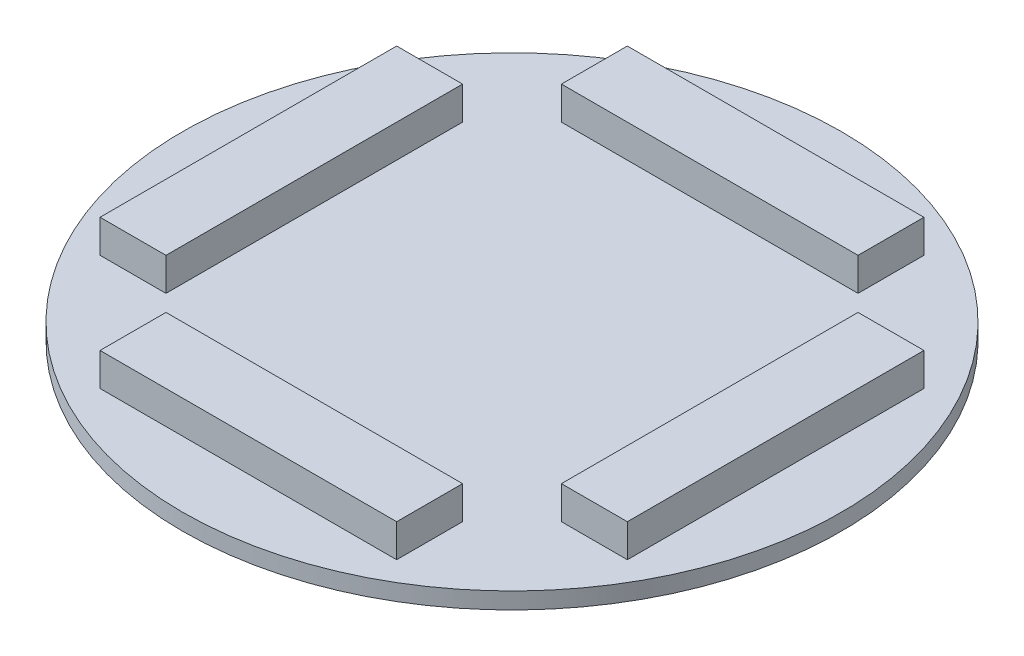
ISO-10303-21;
HEADER;
FILE_DESCRIPTION(('STEP AP214'),'2;1');
FILE_NAME('part.step','',(''),(''),'','','');
FILE_SCHEMA(('AUTOMOTIVE_DESIGN { 1 0 10303 214 1 1 1 1 }'));
ENDSEC;
DATA;
#1=APPLICATION_CONTEXT('core data for automotive mechanical design processes');
#2=APPLICATION_PROTOCOL_DEFINITION('international standard','automotive_design',2000,#1);
#3=PRODUCT_CONTEXT('',#1,'mechanical');
#4=PRODUCT('Part','Part','',(#3));
#5=PRODUCT_RELATED_PRODUCT_CATEGORY('part','',(#4));
#6=PRODUCT_DEFINITION_FORMATION('','',#4);
#7=PRODUCT_DEFINITION_CONTEXT('part definition',#1,'design');
#8=PRODUCT_DEFINITION('design','',#6,#7);
#9=PRODUCT_DEFINITION_SHAPE('','',#8);
#10=(LENGTH_UNIT() NAMED_UNIT(*) SI_UNIT(.MILLI.,.METRE.));
#11=(NAMED_UNIT(*) PLANE_ANGLE_UNIT() SI_UNIT($,.RADIAN.));
#12=(NAMED_UNIT(*) SI_UNIT($,.STERADIAN.) SOLID_ANGLE_UNIT());
#13=UNCERTAINTY_MEASURE_WITH_UNIT(LENGTH_MEASURE(1.E-05),#10,'distance_accuracy_value','');
#14=(GEOMETRIC_REPRESENTATION_CONTEXT(3) GLOBAL_UNCERTAINTY_ASSIGNED_CONTEXT((#13)) GLOBAL_UNIT_ASSIGNED_CONTEXT((#10,
#11,#12)) REPRESENTATION_CONTEXT('',''));
#15=CARTESIAN_POINT('',(0.,0.,0.));
#16=DIRECTION('',(0.,0.,1.));
#17=DIRECTION('',(1.,0.,0.));
#18=AXIS2_PLACEMENT_3D('',#15,#16,#17);
#19=CARTESIAN_POINT('',(0.,1.,0.));
#20=DIRECTION('',(0.,1.,0.));
#21=DIRECTION('',(0.,0.,1.));
#22=AXIS2_PLACEMENT_3D('',#19,#20,#21);
#23=PLANE('',#22);
#24=CARTESIAN_POINT('',(0.,1.,0.));
#25=DIRECTION('',(0.,1.,0.));
#26=DIRECTION('',(0.,0.,1.));
#27=AXIS2_PLACEMENT_3D('',#24,#25,#26);
#28=CIRCLE('',#27,20.);
#29=CARTESIAN_POINT('',(0.,1.,20.));
#30=VERTEX_POINT('',#29);
#31=EDGE_CURVE('E11',#30,#30,#28,.T.);
#32=ORIENTED_EDGE('',*,*,#31,.T.);
#33=EDGE_LOOP('',(#32));
#34=FACE_BOUND('',#33,.T.);
#35=DIRECTION('',(1.,0.,0.));
#36=VECTOR('',#35,1.);
#37=CARTESIAN_POINT('',(-9.,1.,-12.));
#38=LINE('',#37,#36);
#39=CARTESIAN_POINT('',(-9.,1.,-12.));
#40=VERTEX_POINT('',#39);
#41=CARTESIAN_POINT('',(9.,1.,-12.));
#42=VERTEX_POINT('',#41);
#43=EDGE_CURVE('E259',#40,#42,#38,.T.);
#44=ORIENTED_EDGE('',*,*,#43,.F.);
#45=DIRECTION('',(0.,0.,1.));
#46=VECTOR('',#45,1.);
#47=CARTESIAN_POINT('',(-9.,1.,-16.));
#48=LINE('',#47,#46);
#49=CARTESIAN_POINT('',(-9.,1.,-16.));
#50=VERTEX_POINT('',#49);
#51=EDGE_CURVE('E243',#50,#40,#48,.T.);
#52=ORIENTED_EDGE('',*,*,#51,.F.);
#53=DIRECTION('',(1.,0.,0.));
#54=VECTOR('',#53,1.);
#55=CARTESIAN_POINT('',(-9.,1.,-16.));
#56=LINE('',#55,#54);
#57=CARTESIAN_POINT('',(9.,1.,-16.));
#58=VERTEX_POINT('',#57);
#59=EDGE_CURVE('E248',#50,#58,#56,.T.);
#60=ORIENTED_EDGE('',*,*,#59,.T.);
#61=DIRECTION('',(0.,0.,1.));
#62=VECTOR('',#61,1.);
#63=CARTESIAN_POINT('',(9.,1.,-16.));
#64=LINE('',#63,#62);
#65=EDGE_CURVE('E262',#58,#42,#64,.T.);
#66=ORIENTED_EDGE('',*,*,#65,.T.);
#67=EDGE_LOOP('',(#44,#52,#60,#66));
#68=FACE_BOUND('',#67,.T.);
#69=DIRECTION('',(0.,0.,-1.));
#70=VECTOR('',#69,1.);
#71=CARTESIAN_POINT('',(-12.,1.,9.00000000000004));
#72=LINE('',#71,#70);
#73=CARTESIAN_POINT('',(-12.,1.,9.00000000000004));
#74=VERTEX_POINT('',#73);
#75=CARTESIAN_POINT('',(-12.,1.,-8.99999999999996));
#76=VERTEX_POINT('',#75);
#77=EDGE_CURVE('E226',#74,#76,#72,.T.);
#78=ORIENTED_EDGE('',*,*,#77,.F.);
#79=DIRECTION('',(1.,0.,0.));
#80=VECTOR('',#79,1.);
#81=CARTESIAN_POINT('',(-16.,1.,9.00000000000006));
#82=LINE('',#81,#80);
#83=CARTESIAN_POINT('',(-16.,1.,9.00000000000006));
#84=VERTEX_POINT('',#83);
#85=EDGE_CURVE('E210',#84,#74,#82,.T.);
#86=ORIENTED_EDGE('',*,*,#85,.F.);
#87=DIRECTION('',(0.,0.,-1.));
#88=VECTOR('',#87,1.);
#89=CARTESIAN_POINT('',(-16.,1.,9.00000000000006));
#90=LINE('',#89,#88);
#91=CARTESIAN_POINT('',(-16.,1.,-8.99999999999994));
#92=VERTEX_POINT('',#91);
#93=EDGE_CURVE('E215',#84,#92,#90,.T.);
#94=ORIENTED_EDGE('',*,*,#93,.T.);
#95=DIRECTION('',(1.,0.,0.));
#96=VECTOR('',#95,1.);
#97=CARTESIAN_POINT('',(-16.,1.,-8.99999999999994));
#98=LINE('',#97,#96);
#99=EDGE_CURVE('E229',#92,#76,#98,.T.);
#100=ORIENTED_EDGE('',*,*,#99,.T.);
#101=EDGE_LOOP('',(#78,#86,#94,#100));
#102=FACE_BOUND('',#101,.T.);
#103=DIRECTION('',(-1.,0.,0.));
#104=VECTOR('',#103,1.);
#105=CARTESIAN_POINT('',(9.,1.,12.));
#106=LINE('',#105,#104);
#107=CARTESIAN_POINT('',(9.,1.,12.));
#108=VERTEX_POINT('',#107);
#109=CARTESIAN_POINT('',(-9.,1.,12.));
#110=VERTEX_POINT('',#109);
#111=EDGE_CURVE('E175',#108,#110,#106,.T.);
#112=ORIENTED_EDGE('',*,*,#111,.F.);
#113=DIRECTION('',(0.,0.,-1.));
#114=VECTOR('',#113,1.);
#115=CARTESIAN_POINT('',(9.,1.,16.));
#116=LINE('',#115,#114);
#117=CARTESIAN_POINT('',(9.,1.,16.));
#118=VERTEX_POINT('',#117);
#119=EDGE_CURVE('E172',#118,#108,#116,.T.);
#120=ORIENTED_EDGE('',*,*,#119,.F.);
#121=DIRECTION('',(-1.,0.,0.));
#122=VECTOR('',#121,1.);
#123=CARTESIAN_POINT('',(9.,1.,16.));
#124=LINE('',#123,#122);
#125=CARTESIAN_POINT('',(-9.,1.,16.));
#126=VERTEX_POINT('',#125);
#127=EDGE_CURVE('E185',#118,#126,#124,.T.);
#128=ORIENTED_EDGE('',*,*,#127,.T.);
#129=DIRECTION('',(0.,0.,-1.));
#130=VECTOR('',#129,1.);
#131=CARTESIAN_POINT('',(-9.,1.,16.));
#132=LINE('',#131,#130);
#133=EDGE_CURVE('E196',#126,#110,#132,.T.);
#134=ORIENTED_EDGE('',*,*,#133,.T.);
#135=EDGE_LOOP('',(#112,#120,#128,#134));
#136=FACE_BOUND('',#135,.T.);
#137=DIRECTION('',(0.,0.,1.));
#138=VECTOR('',#137,1.);
#139=CARTESIAN_POINT('',(11.9999999999999,1.,-9.00000000000012));
#140=LINE('',#139,#138);
#141=CARTESIAN_POINT('',(11.9999999999999,1.,-9.00000000000012));
#142=VERTEX_POINT('',#141);
#143=CARTESIAN_POINT('',(12.0000000000001,1.,8.99999999999988));
#144=VERTEX_POINT('',#143);
#145=EDGE_CURVE('E52',#142,#144,#140,.T.);
#146=ORIENTED_EDGE('',*,*,#145,.F.);
#147=DIRECTION('',(-1.,0.,0.));
#148=VECTOR('',#147,1.);
#149=CARTESIAN_POINT('',(15.9999999999999,1.,-9.00000000000017));
#150=LINE('',#149,#148);
#151=CARTESIAN_POINT('',(15.9999999999999,1.,-9.00000000000017));
#152=VERTEX_POINT('',#151);
#153=EDGE_CURVE('E171',#152,#142,#150,.T.);
#154=ORIENTED_EDGE('',*,*,#153,.F.);
#155=DIRECTION('',(0.,0.,1.));
#156=VECTOR('',#155,1.);
#157=CARTESIAN_POINT('',(15.9999999999999,1.,-9.00000000000017));
#158=LINE('',#157,#156);
#159=CARTESIAN_POINT('',(16.0000000000001,1.,8.99999999999983));
#160=VERTEX_POINT('',#159);
#161=EDGE_CURVE('E168',#152,#160,#158,.T.);
#162=ORIENTED_EDGE('',*,*,#161,.T.);
#163=DIRECTION('',(-1.,0.,0.));
#164=VECTOR('',#163,1.);
#165=CARTESIAN_POINT('',(16.0000000000001,1.,8.99999999999983));
#166=LINE('',#165,#164);
#167=EDGE_CURVE('E57',#160,#144,#166,.T.);
#168=ORIENTED_EDGE('',*,*,#167,.T.);
#169=EDGE_LOOP('',(#146,#154,#162,#168));
#170=FACE_BOUND('',#169,.T.);
#171=ADVANCED_FACE('F37',(#34,#68,#102,#136,#170),#23,.T.);
#172=CARTESIAN_POINT('',(0.,1.,0.));
#173=DIRECTION('',(0.,-1.,0.));
#174=DIRECTION('',(0.,0.,-1.));
#175=AXIS2_PLACEMENT_3D('',#172,#173,#174);
#176=CYLINDRICAL_SURFACE('',#175,20.);
#177=ORIENTED_EDGE('',*,*,#31,.F.);
#178=EDGE_LOOP('',(#177));
#179=FACE_BOUND('',#178,.T.);
#180=CARTESIAN_POINT('',(0.,0.,0.));
#181=DIRECTION('',(0.,1.,0.));
#182=DIRECTION('',(0.,0.,1.));
#183=AXIS2_PLACEMENT_3D('',#180,#181,#182);
#184=CIRCLE('',#183,20.);
#185=CARTESIAN_POINT('',(0.,0.,20.));
#186=VERTEX_POINT('',#185);
#187=EDGE_CURVE('E41',#186,#186,#184,.T.);
#188=ORIENTED_EDGE('',*,*,#187,.T.);
#189=EDGE_LOOP('',(#188));
#190=FACE_BOUND('',#189,.T.);
#191=ADVANCED_FACE('F39',(#179,#190),#176,.T.);
#192=CARTESIAN_POINT('',(0.,0.,0.));
#193=DIRECTION('',(0.,1.,0.));
#194=DIRECTION('',(0.,0.,1.));
#195=AXIS2_PLACEMENT_3D('',#192,#193,#194);
#196=PLANE('',#195);
#197=ORIENTED_EDGE('',*,*,#187,.F.);
#198=EDGE_LOOP('',(#197));
#199=FACE_BOUND('',#198,.T.);
#200=ADVANCED_FACE('F281',(#199),#196,.F.);
#201=CARTESIAN_POINT('',(-9.,3.,-16.));
#202=DIRECTION('',(1.,0.,0.));
#203=DIRECTION('',(0.,0.,-1.));
#204=AXIS2_PLACEMENT_3D('',#201,#202,#203);
#205=PLANE('',#204);
#206=ORIENTED_EDGE('',*,*,#51,.T.);
#207=DIRECTION('',(0.,-1.,0.));
#208=VECTOR('',#207,1.);
#209=CARTESIAN_POINT('',(-9.,3.,-12.));
#210=LINE('',#209,#208);
#211=CARTESIAN_POINT('',(-9.,3.,-12.));
#212=VERTEX_POINT('',#211);
#213=EDGE_CURVE('E273',#212,#40,#210,.T.);
#214=ORIENTED_EDGE('',*,*,#213,.F.);
#215=DIRECTION('',(0.,0.,1.));
#216=VECTOR('',#215,1.);
#217=CARTESIAN_POINT('',(-9.,3.,-16.));
#218=LINE('',#217,#216);
#219=CARTESIAN_POINT('',(-9.,3.,-16.));
#220=VERTEX_POINT('',#219);
#221=EDGE_CURVE('E244',#220,#212,#218,.T.);
#222=ORIENTED_EDGE('',*,*,#221,.F.);
#223=DIRECTION('',(0.,-1.,0.));
#224=VECTOR('',#223,1.);
#225=CARTESIAN_POINT('',(-9.,3.,-16.));
#226=LINE('',#225,#224);
#227=EDGE_CURVE('E256',#220,#50,#226,.T.);
#228=ORIENTED_EDGE('',*,*,#227,.T.);
#229=EDGE_LOOP('',(#206,#214,#222,#228));
#230=FACE_BOUND('',#229,.T.);
#231=ADVANCED_FACE('F283',(#230),#205,.F.);
#232=CARTESIAN_POINT('',(-9.,3.,-12.));
#233=DIRECTION('',(0.,0.,-1.));
#234=DIRECTION('',(-1.,0.,0.));
#235=AXIS2_PLACEMENT_3D('',#232,#233,#234);
#236=PLANE('',#235);
#237=ORIENTED_EDGE('',*,*,#43,.T.);
#238=DIRECTION('',(0.,-1.,0.));
#239=VECTOR('',#238,1.);
#240=CARTESIAN_POINT('',(9.,3.,-12.));
#241=LINE('',#240,#239);
#242=CARTESIAN_POINT('',(9.,3.,-12.));
#243=VERTEX_POINT('',#242);
#244=EDGE_CURVE('E270',#243,#42,#241,.T.);
#245=ORIENTED_EDGE('',*,*,#244,.F.);
#246=DIRECTION('',(1.,0.,0.));
#247=VECTOR('',#246,1.);
#248=CARTESIAN_POINT('',(-9.,3.,-12.));
#249=LINE('',#248,#247);
#250=EDGE_CURVE('E247',#212,#243,#249,.T.);
#251=ORIENTED_EDGE('',*,*,#250,.F.);
#252=ORIENTED_EDGE('',*,*,#213,.T.);
#253=EDGE_LOOP('',(#237,#245,#251,#252));
#254=FACE_BOUND('',#253,.T.);
#255=ADVANCED_FACE('F288',(#254),#236,.F.);
#256=CARTESIAN_POINT('',(9.,3.,-16.));
#257=DIRECTION('',(1.,0.,0.));
#258=DIRECTION('',(0.,0.,-1.));
#259=AXIS2_PLACEMENT_3D('',#256,#257,#258);
#260=PLANE('',#259);
#261=ORIENTED_EDGE('',*,*,#65,.F.);
#262=DIRECTION('',(0.,-1.,0.));
#263=VECTOR('',#262,1.);
#264=CARTESIAN_POINT('',(9.,3.,-16.));
#265=LINE('',#264,#263);
#266=CARTESIAN_POINT('',(9.,3.,-16.));
#267=VERTEX_POINT('',#266);
#268=EDGE_CURVE('E267',#267,#58,#265,.T.);
#269=ORIENTED_EDGE('',*,*,#268,.F.);
#270=DIRECTION('',(0.,0.,1.));
#271=VECTOR('',#270,1.);
#272=CARTESIAN_POINT('',(9.,3.,-16.));
#273=LINE('',#272,#271);
#274=EDGE_CURVE('E250',#267,#243,#273,.T.);
#275=ORIENTED_EDGE('',*,*,#274,.T.);
#276=ORIENTED_EDGE('',*,*,#244,.T.);
#277=EDGE_LOOP('',(#261,#269,#275,#276));
#278=FACE_BOUND('',#277,.T.);
#279=ADVANCED_FACE('F301',(#278),#260,.T.);
#280=CARTESIAN_POINT('',(-9.,3.,-16.));
#281=DIRECTION('',(0.,0.,-1.));
#282=DIRECTION('',(-1.,0.,0.));
#283=AXIS2_PLACEMENT_3D('',#280,#281,#282);
#284=PLANE('',#283);
#285=ORIENTED_EDGE('',*,*,#59,.F.);
#286=ORIENTED_EDGE('',*,*,#227,.F.);
#287=DIRECTION('',(1.,0.,0.));
#288=VECTOR('',#287,1.);
#289=CARTESIAN_POINT('',(-9.,3.,-16.));
#290=LINE('',#289,#288);
#291=EDGE_CURVE('E253',#220,#267,#290,.T.);
#292=ORIENTED_EDGE('',*,*,#291,.T.);
#293=ORIENTED_EDGE('',*,*,#268,.T.);
#294=EDGE_LOOP('',(#285,#286,#292,#293));
#295=FACE_BOUND('',#294,.T.);
#296=ADVANCED_FACE('F304',(#295),#284,.T.);
#297=CARTESIAN_POINT('',(0.,3.,0.));
#298=DIRECTION('',(0.,1.,0.));
#299=DIRECTION('',(0.,0.,1.));
#300=AXIS2_PLACEMENT_3D('',#297,#298,#299);
#301=PLANE('',#300);
#302=ORIENTED_EDGE('',*,*,#221,.T.);
#303=ORIENTED_EDGE('',*,*,#250,.T.);
#304=ORIENTED_EDGE('',*,*,#274,.F.);
#305=ORIENTED_EDGE('',*,*,#291,.F.);
#306=EDGE_LOOP('',(#302,#303,#304,#305));
#307=FACE_BOUND('',#306,.T.);
#308=ADVANCED_FACE('F308',(#307),#301,.T.);
#309=CARTESIAN_POINT('',(-16.,3.,9.00000000000006));
#310=DIRECTION('',(0.,0.,-1.));
#311=DIRECTION('',(-1.,0.,0.));
#312=AXIS2_PLACEMENT_3D('',#309,#310,#311);
#313=PLANE('',#312);
#314=ORIENTED_EDGE('',*,*,#85,.T.);
#315=DIRECTION('',(0.,-1.,0.));
#316=VECTOR('',#315,1.);
#317=CARTESIAN_POINT('',(-12.,3.,9.00000000000004));
#318=LINE('',#317,#316);
#319=CARTESIAN_POINT('',(-12.,3.,9.00000000000004));
#320=VERTEX_POINT('',#319);
#321=EDGE_CURVE('E240',#320,#74,#318,.T.);
#322=ORIENTED_EDGE('',*,*,#321,.F.);
#323=DIRECTION('',(1.,0.,0.));
#324=VECTOR('',#323,1.);
#325=CARTESIAN_POINT('',(-16.,3.,9.00000000000006));
#326=LINE('',#325,#324);
#327=CARTESIAN_POINT('',(-16.,3.,9.00000000000006));
#328=VERTEX_POINT('',#327);
#329=EDGE_CURVE('E211',#328,#320,#326,.T.);
#330=ORIENTED_EDGE('',*,*,#329,.F.);
#331=DIRECTION('',(0.,-1.,0.));
#332=VECTOR('',#331,1.);
#333=CARTESIAN_POINT('',(-16.,3.,9.00000000000006));
#334=LINE('',#333,#332);
#335=EDGE_CURVE('E223',#328,#84,#334,.T.);
#336=ORIENTED_EDGE('',*,*,#335,.T.);
#337=EDGE_LOOP('',(#314,#322,#330,#336));
#338=FACE_BOUND('',#337,.T.);
#339=ADVANCED_FACE('F312',(#338),#313,.F.);
#340=CARTESIAN_POINT('',(-12.,3.,9.00000000000004));
#341=DIRECTION('',(-1.,0.,0.));
#342=DIRECTION('',(0.,0.,1.));
#343=AXIS2_PLACEMENT_3D('',#340,#341,#342);
#344=PLANE('',#343);
#345=ORIENTED_EDGE('',*,*,#77,.T.);
#346=DIRECTION('',(0.,-1.,0.));
#347=VECTOR('',#346,1.);
#348=CARTESIAN_POINT('',(-12.,3.,-8.99999999999996));
#349=LINE('',#348,#347);
#350=CARTESIAN_POINT('',(-12.,3.,-8.99999999999996));
#351=VERTEX_POINT('',#350);
#352=EDGE_CURVE('E237',#351,#76,#349,.T.);
#353=ORIENTED_EDGE('',*,*,#352,.F.);
#354=DIRECTION('',(0.,0.,-1.));
#355=VECTOR('',#354,1.);
#356=CARTESIAN_POINT('',(-12.,3.,9.00000000000004));
#357=LINE('',#356,#355);
#358=EDGE_CURVE('E214',#320,#351,#357,.T.);
#359=ORIENTED_EDGE('',*,*,#358,.F.);
#360=ORIENTED_EDGE('',*,*,#321,.T.);
#361=EDGE_LOOP('',(#345,#353,#359,#360));
#362=FACE_BOUND('',#361,.T.);
#363=ADVANCED_FACE('F316',(#362),#344,.F.);
#364=CARTESIAN_POINT('',(-16.,3.,-8.99999999999994));
#365=DIRECTION('',(0.,0.,-1.));
#366=DIRECTION('',(-1.,0.,0.));
#367=AXIS2_PLACEMENT_3D('',#364,#365,#366);
#368=PLANE('',#367);
#369=ORIENTED_EDGE('',*,*,#99,.F.);
#370=DIRECTION('',(0.,-1.,0.));
#371=VECTOR('',#370,1.);
#372=CARTESIAN_POINT('',(-16.,3.,-8.99999999999994));
#373=LINE('',#372,#371);
#374=CARTESIAN_POINT('',(-16.,3.,-8.99999999999994));
#375=VERTEX_POINT('',#374);
#376=EDGE_CURVE('E234',#375,#92,#373,.T.);
#377=ORIENTED_EDGE('',*,*,#376,.F.);
#378=DIRECTION('',(1.,0.,0.));
#379=VECTOR('',#378,1.);
#380=CARTESIAN_POINT('',(-16.,3.,-8.99999999999994));
#381=LINE('',#380,#379);
#382=EDGE_CURVE('E217',#375,#351,#381,.T.);
#383=ORIENTED_EDGE('',*,*,#382,.T.);
#384=ORIENTED_EDGE('',*,*,#352,.T.);
#385=EDGE_LOOP('',(#369,#377,#383,#384));
#386=FACE_BOUND('',#385,.T.);
#387=ADVANCED_FACE('F320',(#386),#368,.T.);
#388=CARTESIAN_POINT('',(-16.,3.,9.00000000000006));
#389=DIRECTION('',(-1.,0.,0.));
#390=DIRECTION('',(0.,0.,1.));
#391=AXIS2_PLACEMENT_3D('',#388,#389,#390);
#392=PLANE('',#391);
#393=ORIENTED_EDGE('',*,*,#93,.F.);
#394=ORIENTED_EDGE('',*,*,#335,.F.);
#395=DIRECTION('',(0.,0.,-1.));
#396=VECTOR('',#395,1.);
#397=CARTESIAN_POINT('',(-16.,3.,9.00000000000006));
#398=LINE('',#397,#396);
#399=EDGE_CURVE('E220',#328,#375,#398,.T.);
#400=ORIENTED_EDGE('',*,*,#399,.T.);
#401=ORIENTED_EDGE('',*,*,#376,.T.);
#402=EDGE_LOOP('',(#393,#394,#400,#401));
#403=FACE_BOUND('',#402,.T.);
#404=ADVANCED_FACE('F324',(#403),#392,.T.);
#405=CARTESIAN_POINT('',(0.,3.,0.));
#406=DIRECTION('',(0.,1.,0.));
#407=DIRECTION('',(1.,0.,0.));
#408=AXIS2_PLACEMENT_3D('',#405,#406,#407);
#409=PLANE('',#408);
#410=ORIENTED_EDGE('',*,*,#329,.T.);
#411=ORIENTED_EDGE('',*,*,#358,.T.);
#412=ORIENTED_EDGE('',*,*,#382,.F.);
#413=ORIENTED_EDGE('',*,*,#399,.F.);
#414=EDGE_LOOP('',(#410,#411,#412,#413));
#415=FACE_BOUND('',#414,.T.);
#416=ADVANCED_FACE('F328',(#415),#409,.T.);
#417=CARTESIAN_POINT('',(9.,3.,16.));
#418=DIRECTION('',(-1.,0.,0.));
#419=DIRECTION('',(0.,0.,1.));
#420=AXIS2_PLACEMENT_3D('',#417,#418,#419);
#421=PLANE('',#420);
#422=ORIENTED_EDGE('',*,*,#119,.T.);
#423=DIRECTION('',(0.,-1.,0.));
#424=VECTOR('',#423,1.);
#425=CARTESIAN_POINT('',(9.,3.,12.));
#426=LINE('',#425,#424);
#427=CARTESIAN_POINT('',(9.,3.,12.));
#428=VERTEX_POINT('',#427);
#429=EDGE_CURVE('E207',#428,#108,#426,.T.);
#430=ORIENTED_EDGE('',*,*,#429,.F.);
#431=DIRECTION('',(0.,0.,-1.));
#432=VECTOR('',#431,1.);
#433=CARTESIAN_POINT('',(9.,3.,16.));
#434=LINE('',#433,#432);
#435=CARTESIAN_POINT('',(9.,3.,16.));
#436=VERTEX_POINT('',#435);
#437=EDGE_CURVE('E181',#436,#428,#434,.T.);
#438=ORIENTED_EDGE('',*,*,#437,.F.);
#439=DIRECTION('',(0.,-1.,0.));
#440=VECTOR('',#439,1.);
#441=CARTESIAN_POINT('',(9.,3.,16.));
#442=LINE('',#441,#440);
#443=EDGE_CURVE('E192',#436,#118,#442,.T.);
#444=ORIENTED_EDGE('',*,*,#443,.T.);
#445=EDGE_LOOP('',(#422,#430,#438,#444));
#446=FACE_BOUND('',#445,.T.);
#447=ADVANCED_FACE('F332',(#446),#421,.F.);
#448=CARTESIAN_POINT('',(9.,3.,12.));
#449=DIRECTION('',(0.,0.,1.));
#450=DIRECTION('',(1.,0.,0.));
#451=AXIS2_PLACEMENT_3D('',#448,#449,#450);
#452=PLANE('',#451);
#453=ORIENTED_EDGE('',*,*,#111,.T.);
#454=DIRECTION('',(0.,-1.,0.));
#455=VECTOR('',#454,1.);
#456=CARTESIAN_POINT('',(-9.,3.,12.));
#457=LINE('',#456,#455);
#458=CARTESIAN_POINT('',(-9.,3.,12.));
#459=VERTEX_POINT('',#458);
#460=EDGE_CURVE('E204',#459,#110,#457,.T.);
#461=ORIENTED_EDGE('',*,*,#460,.F.);
#462=DIRECTION('',(-1.,0.,0.));
#463=VECTOR('',#462,1.);
#464=CARTESIAN_POINT('',(9.,3.,12.));
#465=LINE('',#464,#463);
#466=EDGE_CURVE('E184',#428,#459,#465,.T.);
#467=ORIENTED_EDGE('',*,*,#466,.F.);
#468=ORIENTED_EDGE('',*,*,#429,.T.);
#469=EDGE_LOOP('',(#453,#461,#467,#468));
#470=FACE_BOUND('',#469,.T.);
#471=ADVANCED_FACE('F336',(#470),#452,.F.);
#472=CARTESIAN_POINT('',(-9.,3.,16.));
#473=DIRECTION('',(-1.,0.,0.));
#474=DIRECTION('',(0.,0.,1.));
#475=AXIS2_PLACEMENT_3D('',#472,#473,#474);
#476=PLANE('',#475);
#477=ORIENTED_EDGE('',*,*,#133,.F.);
#478=DIRECTION('',(0.,-1.,0.));
#479=VECTOR('',#478,1.);
#480=CARTESIAN_POINT('',(-9.,3.,16.));
#481=LINE('',#480,#479);
#482=CARTESIAN_POINT('',(-9.,3.,16.));
#483=VERTEX_POINT('',#482);
#484=EDGE_CURVE('E201',#483,#126,#481,.T.);
#485=ORIENTED_EDGE('',*,*,#484,.F.);
#486=DIRECTION('',(0.,0.,-1.));
#487=VECTOR('',#486,1.);
#488=CARTESIAN_POINT('',(-9.,3.,16.));
#489=LINE('',#488,#487);
#490=EDGE_CURVE('E187',#483,#459,#489,.T.);
#491=ORIENTED_EDGE('',*,*,#490,.T.);
#492=ORIENTED_EDGE('',*,*,#460,.T.);
#493=EDGE_LOOP('',(#477,#485,#491,#492));
#494=FACE_BOUND('',#493,.T.);
#495=ADVANCED_FACE('F340',(#494),#476,.T.);
#496=CARTESIAN_POINT('',(9.,3.,16.));
#497=DIRECTION('',(0.,0.,1.));
#498=DIRECTION('',(1.,0.,0.));
#499=AXIS2_PLACEMENT_3D('',#496,#497,#498);
#500=PLANE('',#499);
#501=ORIENTED_EDGE('',*,*,#127,.F.);
#502=ORIENTED_EDGE('',*,*,#443,.F.);
#503=DIRECTION('',(-1.,0.,0.));
#504=VECTOR('',#503,1.);
#505=CARTESIAN_POINT('',(9.,3.,16.));
#506=LINE('',#505,#504);
#507=EDGE_CURVE('E190',#436,#483,#506,.T.);
#508=ORIENTED_EDGE('',*,*,#507,.T.);
#509=ORIENTED_EDGE('',*,*,#484,.T.);
#510=EDGE_LOOP('',(#501,#502,#508,#509));
#511=FACE_BOUND('',#510,.T.);
#512=ADVANCED_FACE('F344',(#511),#500,.T.);
#513=CARTESIAN_POINT('',(0.,3.,0.));
#514=DIRECTION('',(0.,1.,0.));
#515=DIRECTION('',(0.,0.,-1.));
#516=AXIS2_PLACEMENT_3D('',#513,#514,#515);
#517=PLANE('',#516);
#518=ORIENTED_EDGE('',*,*,#437,.T.);
#519=ORIENTED_EDGE('',*,*,#466,.T.);
#520=ORIENTED_EDGE('',*,*,#490,.F.);
#521=ORIENTED_EDGE('',*,*,#507,.F.);
#522=EDGE_LOOP('',(#518,#519,#520,#521));
#523=FACE_BOUND('',#522,.T.);
#524=ADVANCED_FACE('F348',(#523),#517,.T.);
#525=CARTESIAN_POINT('',(15.9999999999999,3.,-9.00000000000017));
#526=DIRECTION('',(0.,0.,1.));
#527=DIRECTION('',(1.,0.,0.));
#528=AXIS2_PLACEMENT_3D('',#525,#526,#527);
#529=PLANE('',#528);
#530=ORIENTED_EDGE('',*,*,#153,.T.);
#531=DIRECTION('',(0.,-1.,0.));
#532=VECTOR('',#531,1.);
#533=CARTESIAN_POINT('',(11.9999999999999,3.,-9.00000000000012));
#534=LINE('',#533,#532);
#535=CARTESIAN_POINT('',(11.9999999999999,3.,-9.00000000000012));
#536=VERTEX_POINT('',#535);
#537=EDGE_CURVE('E152',#536,#142,#534,.T.);
#538=ORIENTED_EDGE('',*,*,#537,.F.);
#539=DIRECTION('',(-1.,0.,0.));
#540=VECTOR('',#539,1.);
#541=CARTESIAN_POINT('',(15.9999999999999,3.,-9.00000000000017));
#542=LINE('',#541,#540);
#543=CARTESIAN_POINT('',(15.9999999999999,3.,-9.00000000000017));
#544=VERTEX_POINT('',#543);
#545=EDGE_CURVE('E159',#544,#536,#542,.T.);
#546=ORIENTED_EDGE('',*,*,#545,.F.);
#547=DIRECTION('',(0.,-1.,0.));
#548=VECTOR('',#547,1.);
#549=CARTESIAN_POINT('',(15.9999999999999,3.,-9.00000000000017));
#550=LINE('',#549,#548);
#551=EDGE_CURVE('E532',#544,#152,#550,.T.);
#552=ORIENTED_EDGE('',*,*,#551,.T.);
#553=EDGE_LOOP('',(#530,#538,#546,#552));
#554=FACE_BOUND('',#553,.T.);
#555=ADVANCED_FACE('F170',(#554),#529,.F.);
#556=CARTESIAN_POINT('',(11.9999999999999,3.,-9.00000000000012));
#557=DIRECTION('',(1.,0.,0.));
#558=DIRECTION('',(0.,0.,-1.));
#559=AXIS2_PLACEMENT_3D('',#556,#557,#558);
#560=PLANE('',#559);
#561=ORIENTED_EDGE('',*,*,#145,.T.);
#562=DIRECTION('',(0.,-1.,0.));
#563=VECTOR('',#562,1.);
#564=CARTESIAN_POINT('',(12.0000000000001,3.,8.99999999999988));
#565=LINE('',#564,#563);
#566=CARTESIAN_POINT('',(12.0000000000001,3.,8.99999999999988));
#567=VERTEX_POINT('',#566);
#568=EDGE_CURVE('E154',#567,#144,#565,.T.);
#569=ORIENTED_EDGE('',*,*,#568,.F.);
#570=DIRECTION('',(0.,0.,1.));
#571=VECTOR('',#570,1.);
#572=CARTESIAN_POINT('',(11.9999999999999,3.,-9.00000000000012));
#573=LINE('',#572,#571);
#574=EDGE_CURVE('E148',#536,#567,#573,.T.);
#575=ORIENTED_EDGE('',*,*,#574,.F.);
#576=ORIENTED_EDGE('',*,*,#537,.T.);
#577=EDGE_LOOP('',(#561,#569,#575,#576));
#578=FACE_BOUND('',#577,.T.);
#579=ADVANCED_FACE('F150',(#578),#560,.F.);
#580=CARTESIAN_POINT('',(16.0000000000001,3.,8.99999999999983));
#581=DIRECTION('',(0.,0.,1.));
#582=DIRECTION('',(1.,0.,0.));
#583=AXIS2_PLACEMENT_3D('',#580,#581,#582);
#584=PLANE('',#583);
#585=ORIENTED_EDGE('',*,*,#167,.F.);
#586=DIRECTION('',(0.,-1.,0.));
#587=VECTOR('',#586,1.);
#588=CARTESIAN_POINT('',(16.0000000000001,3.,8.99999999999983));
#589=LINE('',#588,#587);
#590=CARTESIAN_POINT('',(16.0000000000001,3.,8.99999999999983));
#591=VERTEX_POINT('',#590);
#592=EDGE_CURVE('E177',#591,#160,#589,.T.);
#593=ORIENTED_EDGE('',*,*,#592,.F.);
#594=DIRECTION('',(-1.,0.,0.));
#595=VECTOR('',#594,1.);
#596=CARTESIAN_POINT('',(16.0000000000001,3.,8.99999999999983));
#597=LINE('',#596,#595);
#598=EDGE_CURVE('E158',#591,#567,#597,.T.);
#599=ORIENTED_EDGE('',*,*,#598,.T.);
#600=ORIENTED_EDGE('',*,*,#568,.T.);
#601=EDGE_LOOP('',(#585,#593,#599,#600));
#602=FACE_BOUND('',#601,.T.);
#603=ADVANCED_FACE('F357',(#602),#584,.T.);
#604=CARTESIAN_POINT('',(15.9999999999999,3.,-9.00000000000017));
#605=DIRECTION('',(1.,0.,0.));
#606=DIRECTION('',(0.,0.,-1.));
#607=AXIS2_PLACEMENT_3D('',#604,#605,#606);
#608=PLANE('',#607);
#609=ORIENTED_EDGE('',*,*,#161,.F.);
#610=ORIENTED_EDGE('',*,*,#551,.F.);
#611=DIRECTION('',(0.,0.,1.));
#612=VECTOR('',#611,1.);
#613=CARTESIAN_POINT('',(15.9999999999999,3.,-9.00000000000017));
#614=LINE('',#613,#612);
#615=EDGE_CURVE('E165',#544,#591,#614,.T.);
#616=ORIENTED_EDGE('',*,*,#615,.T.);
#617=ORIENTED_EDGE('',*,*,#592,.T.);
#618=EDGE_LOOP('',(#609,#610,#616,#617));
#619=FACE_BOUND('',#618,.T.);
#620=ADVANCED_FACE('F360',(#619),#608,.T.);
#621=CARTESIAN_POINT('',(0.,3.,0.));
#622=DIRECTION('',(0.,1.,0.));
#623=DIRECTION('',(-1.,0.,0.));
#624=AXIS2_PLACEMENT_3D('',#621,#622,#623);
#625=PLANE('',#624);
#626=ORIENTED_EDGE('',*,*,#545,.T.);
#627=ORIENTED_EDGE('',*,*,#574,.T.);
#628=ORIENTED_EDGE('',*,*,#598,.F.);
#629=ORIENTED_EDGE('',*,*,#615,.F.);
#630=EDGE_LOOP('',(#626,#627,#628,#629));
#631=FACE_BOUND('',#630,.T.);
#632=ADVANCED_FACE('F163',(#631),#625,.T.);
#633=CLOSED_SHELL('',(#171,#191,#200,#231,#255,#279,#296,#308,#339,#363,#387,#404,#416,#447,
#471,#495,#512,#524,#555,#579,#603,#620,#632));
#634=MANIFOLD_SOLID_BREP('B2',#633);
#635=ADVANCED_BREP_SHAPE_REPRESENTATION('',(#18,#634),#14);
#636=SHAPE_DEFINITION_REPRESENTATION(#9,#635);
ENDSEC;
END-ISO-10303-21;
